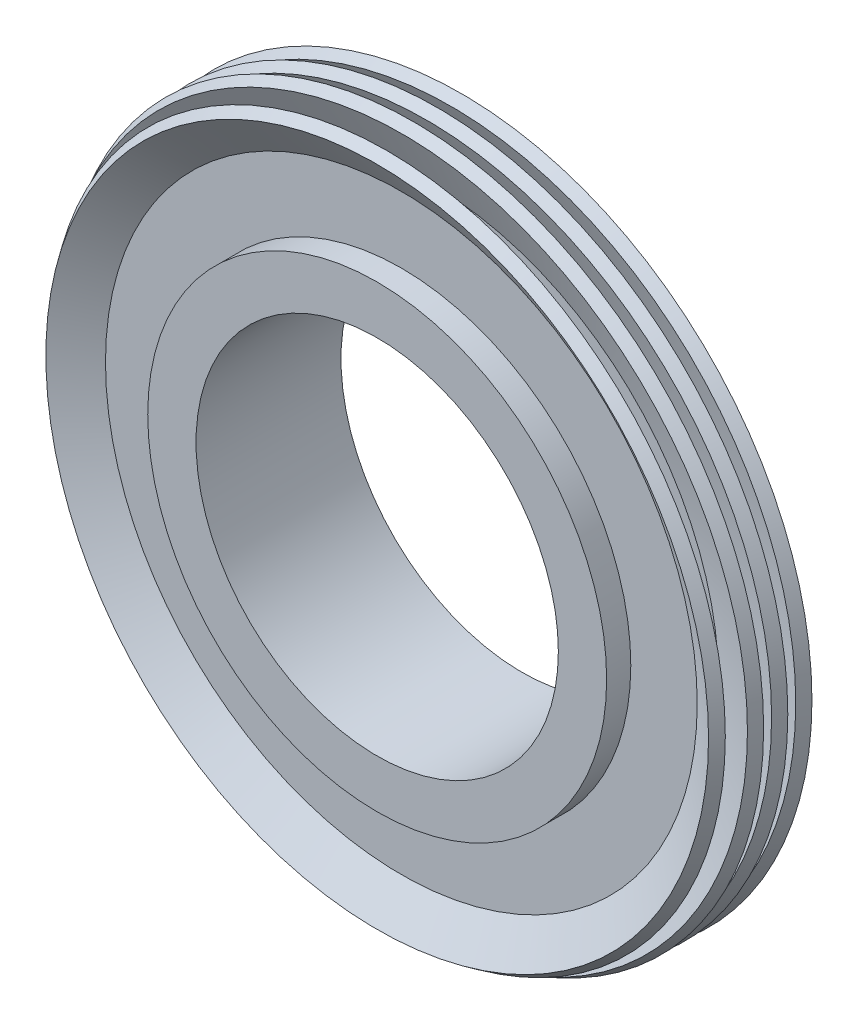
ISO-10303-21;
HEADER;
FILE_DESCRIPTION(('STEP AP214'),'2;1');
FILE_NAME('part.step','',(''),(''),'','','');
FILE_SCHEMA(('AUTOMOTIVE_DESIGN { 1 0 10303 214 1 1 1 1 }'));
ENDSEC;
DATA;
#1=APPLICATION_CONTEXT('core data for automotive mechanical design processes');
#2=APPLICATION_PROTOCOL_DEFINITION('international standard','automotive_design',2000,#1);
#3=PRODUCT_CONTEXT('',#1,'mechanical');
#4=PRODUCT('Part','Part','',(#3));
#5=PRODUCT_RELATED_PRODUCT_CATEGORY('part','',(#4));
#6=PRODUCT_DEFINITION_FORMATION('','',#4);
#7=PRODUCT_DEFINITION_CONTEXT('part definition',#1,'design');
#8=PRODUCT_DEFINITION('design','',#6,#7);
#9=PRODUCT_DEFINITION_SHAPE('','',#8);
#10=(LENGTH_UNIT() NAMED_UNIT(*) SI_UNIT(.MILLI.,.METRE.));
#11=(NAMED_UNIT(*) PLANE_ANGLE_UNIT() SI_UNIT($,.RADIAN.));
#12=(NAMED_UNIT(*) SI_UNIT($,.STERADIAN.) SOLID_ANGLE_UNIT());
#13=UNCERTAINTY_MEASURE_WITH_UNIT(LENGTH_MEASURE(1.E-05),#10,'distance_accuracy_value','');
#14=(GEOMETRIC_REPRESENTATION_CONTEXT(3) GLOBAL_UNCERTAINTY_ASSIGNED_CONTEXT((#13)) GLOBAL_UNIT_ASSIGNED_CONTEXT((#10,
#11,#12)) REPRESENTATION_CONTEXT('',''));
#15=CARTESIAN_POINT('',(0.,0.,0.));
#16=DIRECTION('',(0.,0.,1.));
#17=DIRECTION('',(1.,0.,0.));
#18=AXIS2_PLACEMENT_3D('',#15,#16,#17);
#19=CARTESIAN_POINT('',(0.,0.,12.));
#20=DIRECTION('',(0.,0.,-1.));
#21=DIRECTION('',(-1.,0.,0.));
#22=AXIS2_PLACEMENT_3D('',#19,#20,#21);
#23=CYLINDRICAL_SURFACE('',#22,19.);
#24=CARTESIAN_POINT('',(0.,0.,2.));
#25=DIRECTION('',(0.,0.,1.));
#26=DIRECTION('',(1.,0.,0.));
#27=AXIS2_PLACEMENT_3D('',#24,#25,#26);
#28=CIRCLE('',#27,19.);
#29=CARTESIAN_POINT('',(19.,0.,2.));
#30=VERTEX_POINT('',#29);
#31=EDGE_CURVE('E45',#30,#30,#28,.T.);
#32=ORIENTED_EDGE('',*,*,#31,.T.);
#33=EDGE_LOOP('',(#32));
#34=FACE_BOUND('',#33,.T.);
#35=CARTESIAN_POINT('',(0.,0.,2.5));
#36=DIRECTION('',(0.,0.,1.));
#37=DIRECTION('',(1.,0.,0.));
#38=AXIS2_PLACEMENT_3D('',#35,#36,#37);
#39=CIRCLE('',#38,19.);
#40=CARTESIAN_POINT('',(19.,0.,2.5));
#41=VERTEX_POINT('',#40);
#42=EDGE_CURVE('E10',#41,#41,#39,.T.);
#43=ORIENTED_EDGE('',*,*,#42,.F.);
#44=EDGE_LOOP('',(#43));
#45=FACE_BOUND('',#44,.T.);
#46=ADVANCED_FACE('F30',(#34,#45),#23,.T.);
#47=CARTESIAN_POINT('',(0.,0.,12.));
#48=DIRECTION('',(0.,0.,1.));
#49=DIRECTION('',(1.,0.,0.));
#50=AXIS2_PLACEMENT_3D('',#47,#48,#49);
#51=CIRCLE('',#50,19.);
#52=CARTESIAN_POINT('',(19.,0.,12.));
#53=VERTEX_POINT('',#52);
#54=EDGE_CURVE('E50',#53,#53,#51,.T.);
#55=ORIENTED_EDGE('',*,*,#54,.F.);
#56=EDGE_LOOP('',(#55));
#57=FACE_BOUND('',#56,.T.);
#58=CARTESIAN_POINT('',(0.,0.,10.));
#59=DIRECTION('',(0.,0.,-1.));
#60=DIRECTION('',(-1.,0.,0.));
#61=AXIS2_PLACEMENT_3D('',#58,#59,#60);
#62=CIRCLE('',#61,19.);
#63=CARTESIAN_POINT('',(-19.,0.,10.));
#64=VERTEX_POINT('',#63);
#65=EDGE_CURVE('E37',#64,#64,#62,.T.);
#66=ORIENTED_EDGE('',*,*,#65,.F.);
#67=EDGE_LOOP('',(#66));
#68=FACE_BOUND('',#67,.T.);
#69=ADVANCED_FACE('F264',(#57,#68),#23,.T.);
#70=CARTESIAN_POINT('',(0.,0.,12.));
#71=DIRECTION('',(0.,0.,1.));
#72=DIRECTION('',(1.,0.,0.));
#73=AXIS2_PLACEMENT_3D('',#70,#71,#72);
#74=PLANE('',#73);
#75=ORIENTED_EDGE('',*,*,#54,.T.);
#76=EDGE_LOOP('',(#75));
#77=FACE_BOUND('',#76,.T.);
#78=CARTESIAN_POINT('',(0.,0.,12.));
#79=DIRECTION('',(0.,0.,1.));
#80=DIRECTION('',(1.,0.,0.));
#81=AXIS2_PLACEMENT_3D('',#78,#79,#80);
#82=CIRCLE('',#81,15.);
#83=CARTESIAN_POINT('',(15.,0.,12.));
#84=VERTEX_POINT('',#83);
#85=EDGE_CURVE('E53',#84,#84,#82,.T.);
#86=ORIENTED_EDGE('',*,*,#85,.F.);
#87=EDGE_LOOP('',(#86));
#88=FACE_BOUND('',#87,.T.);
#89=ADVANCED_FACE('F269',(#77,#88),#74,.T.);
#90=CARTESIAN_POINT('',(0.,0.,0.));
#91=DIRECTION('',(0.,0.,1.));
#92=DIRECTION('',(1.,0.,0.));
#93=AXIS2_PLACEMENT_3D('',#90,#91,#92);
#94=PLANE('',#93);
#95=CARTESIAN_POINT('',(0.,0.,0.));
#96=DIRECTION('',(0.,0.,1.));
#97=DIRECTION('',(1.,0.,0.));
#98=AXIS2_PLACEMENT_3D('',#95,#96,#97);
#99=CIRCLE('',#98,15.5);
#100=CARTESIAN_POINT('',(15.5,0.,0.));
#101=VERTEX_POINT('',#100);
#102=EDGE_CURVE('E41',#101,#101,#99,.F.);
#103=ORIENTED_EDGE('',*,*,#102,.T.);
#104=EDGE_LOOP('',(#103));
#105=FACE_BOUND('',#104,.T.);
#106=CARTESIAN_POINT('',(0.,0.,0.));
#107=DIRECTION('',(0.,0.,1.));
#108=DIRECTION('',(1.,0.,0.));
#109=AXIS2_PLACEMENT_3D('',#106,#107,#108);
#110=CIRCLE('',#109,15.);
#111=CARTESIAN_POINT('',(15.,0.,0.));
#112=VERTEX_POINT('',#111);
#113=EDGE_CURVE('E54',#112,#112,#110,.T.);
#114=ORIENTED_EDGE('',*,*,#113,.T.);
#115=EDGE_LOOP('',(#114));
#116=FACE_BOUND('',#115,.T.);
#117=ADVANCED_FACE('F273',(#105,#116),#94,.F.);
#118=CARTESIAN_POINT('',(0.,0.,12.));
#119=DIRECTION('',(0.,0.,-1.));
#120=DIRECTION('',(-1.,0.,0.));
#121=AXIS2_PLACEMENT_3D('',#118,#119,#120);
#122=CYLINDRICAL_SURFACE('',#121,15.);
#123=ORIENTED_EDGE('',*,*,#85,.T.);
#124=EDGE_LOOP('',(#123));
#125=FACE_BOUND('',#124,.T.);
#126=ORIENTED_EDGE('',*,*,#113,.F.);
#127=EDGE_LOOP('',(#126));
#128=FACE_BOUND('',#127,.T.);
#129=ADVANCED_FACE('F260',(#125,#128),#122,.F.);
#130=CARTESIAN_POINT('',(0.,0.,2.));
#131=DIRECTION('',(0.,0.,1.));
#132=DIRECTION('',(1.,0.,0.));
#133=AXIS2_PLACEMENT_3D('',#130,#131,#132);
#134=CONICAL_SURFACE('',#133,19.,1.05165021254838);
#135=ORIENTED_EDGE('',*,*,#102,.F.);
#136=EDGE_LOOP('',(#135));
#137=FACE_BOUND('',#136,.T.);
#138=ORIENTED_EDGE('',*,*,#31,.F.);
#139=EDGE_LOOP('',(#138));
#140=FACE_BOUND('',#139,.T.);
#141=ADVANCED_FACE('F32',(#137,#140),#134,.T.);
#142=CARTESIAN_POINT('',(0.,19.,2.5));
#143=DIRECTION('',(0.,0.,1.));
#144=DIRECTION('',(1.,0.,0.));
#145=AXIS2_PLACEMENT_3D('',#142,#143,#144);
#146=PLANE('',#145);
#147=CARTESIAN_POINT('',(0.,0.,2.5));
#148=DIRECTION('',(0.,0.,1.));
#149=DIRECTION('',(1.,0.,0.));
#150=AXIS2_PLACEMENT_3D('',#147,#148,#149);
#151=CIRCLE('',#150,24.);
#152=CARTESIAN_POINT('',(24.,0.,2.5));
#153=VERTEX_POINT('',#152);
#154=EDGE_CURVE('E57',#153,#153,#151,.T.);
#155=ORIENTED_EDGE('',*,*,#154,.F.);
#156=EDGE_LOOP('',(#155));
#157=FACE_BOUND('',#156,.T.);
#158=ORIENTED_EDGE('',*,*,#42,.T.);
#159=EDGE_LOOP('',(#158));
#160=FACE_BOUND('',#159,.T.);
#161=ADVANCED_FACE('F251',(#157,#160),#146,.F.);
#162=CARTESIAN_POINT('',(0.,0.,2.5));
#163=DIRECTION('',(0.,0.,1.));
#164=DIRECTION('',(1.,0.,0.));
#165=AXIS2_PLACEMENT_3D('',#162,#163,#164);
#166=CONICAL_SURFACE('',#165,24.,1.10714871779409);
#167=CARTESIAN_POINT('',(0.,0.,5.));
#168=DIRECTION('',(0.,0.,1.));
#169=DIRECTION('',(1.,0.,0.));
#170=AXIS2_PLACEMENT_3D('',#167,#168,#169);
#171=CIRCLE('',#170,29.);
#172=CARTESIAN_POINT('',(29.,0.,5.));
#173=VERTEX_POINT('',#172);
#174=EDGE_CURVE('E62',#173,#173,#171,.T.);
#175=ORIENTED_EDGE('',*,*,#174,.F.);
#176=EDGE_LOOP('',(#175));
#177=FACE_BOUND('',#176,.T.);
#178=ORIENTED_EDGE('',*,*,#154,.T.);
#179=EDGE_LOOP('',(#178));
#180=FACE_BOUND('',#179,.T.);
#181=ADVANCED_FACE('F245',(#177,#180),#166,.T.);
#182=CARTESIAN_POINT('',(0.,0.,5.));
#183=DIRECTION('',(0.,0.,-1.));
#184=DIRECTION('',(-1.,0.,0.));
#185=AXIS2_PLACEMENT_3D('',#182,#183,#184);
#186=CONICAL_SURFACE('',#185,29.,0.463647609000805);
#187=CARTESIAN_POINT('',(0.,0.,5.89442719099991));
#188=DIRECTION('',(0.,0.,1.));
#189=DIRECTION('',(1.,0.,0.));
#190=AXIS2_PLACEMENT_3D('',#187,#188,#189);
#191=CIRCLE('',#190,28.5527864045);
#192=CARTESIAN_POINT('',(28.5527864045,0.,5.89442719099991));
#193=VERTEX_POINT('',#192);
#194=EDGE_CURVE('E65',#193,#193,#191,.T.);
#195=ORIENTED_EDGE('',*,*,#194,.F.);
#196=EDGE_LOOP('',(#195));
#197=FACE_BOUND('',#196,.T.);
#198=ORIENTED_EDGE('',*,*,#174,.T.);
#199=EDGE_LOOP('',(#198));
#200=FACE_BOUND('',#199,.T.);
#201=ADVANCED_FACE('F239',(#197,#200),#186,.T.);
#202=CARTESIAN_POINT('',(0.,0.,5.89442719099991));
#203=DIRECTION('',(0.,0.,1.));
#204=DIRECTION('',(1.,0.,0.));
#205=AXIS2_PLACEMENT_3D('',#202,#203,#204);
#206=CONICAL_SURFACE('',#205,28.5527864045,1.10714871779409);
#207=CARTESIAN_POINT('',(0.,0.,3.5));
#208=DIRECTION('',(0.,0.,1.));
#209=DIRECTION('',(1.,0.,0.));
#210=AXIS2_PLACEMENT_3D('',#207,#208,#209);
#211=CIRCLE('',#210,23.7639320225002);
#212=CARTESIAN_POINT('',(23.7639320225002,0.,3.5));
#213=VERTEX_POINT('',#212);
#214=EDGE_CURVE('E68',#213,#213,#211,.T.);
#215=ORIENTED_EDGE('',*,*,#214,.F.);
#216=EDGE_LOOP('',(#215));
#217=FACE_BOUND('',#216,.T.);
#218=ORIENTED_EDGE('',*,*,#194,.T.);
#219=EDGE_LOOP('',(#218));
#220=FACE_BOUND('',#219,.T.);
#221=ADVANCED_FACE('F233',(#217,#220),#206,.F.);
#222=CARTESIAN_POINT('',(0.,20.,3.5));
#223=DIRECTION('',(0.,0.,-1.));
#224=DIRECTION('',(-1.,0.,0.));
#225=AXIS2_PLACEMENT_3D('',#222,#223,#224);
#226=PLANE('',#225);
#227=CARTESIAN_POINT('',(0.,0.,3.5));
#228=DIRECTION('',(0.,0.,1.));
#229=DIRECTION('',(1.,0.,0.));
#230=AXIS2_PLACEMENT_3D('',#227,#228,#229);
#231=CIRCLE('',#230,20.);
#232=CARTESIAN_POINT('',(20.,0.,3.5));
#233=VERTEX_POINT('',#232);
#234=EDGE_CURVE('E71',#233,#233,#231,.T.);
#235=ORIENTED_EDGE('',*,*,#234,.F.);
#236=EDGE_LOOP('',(#235));
#237=FACE_BOUND('',#236,.T.);
#238=ORIENTED_EDGE('',*,*,#214,.T.);
#239=EDGE_LOOP('',(#238));
#240=FACE_BOUND('',#239,.T.);
#241=ADVANCED_FACE('F227',(#237,#240),#226,.F.);
#242=CARTESIAN_POINT('',(0.,0.,10.));
#243=DIRECTION('',(0.,0.,1.));
#244=DIRECTION('',(1.,0.,0.));
#245=AXIS2_PLACEMENT_3D('',#242,#243,#244);
#246=CYLINDRICAL_SURFACE('',#245,20.);
#247=CARTESIAN_POINT('',(0.,0.,4.5));
#248=DIRECTION('',(0.,0.,1.));
#249=DIRECTION('',(1.,0.,0.));
#250=AXIS2_PLACEMENT_3D('',#247,#248,#249);
#251=CIRCLE('',#250,20.);
#252=CARTESIAN_POINT('',(20.,0.,4.5));
#253=VERTEX_POINT('',#252);
#254=EDGE_CURVE('E74',#253,#253,#251,.T.);
#255=ORIENTED_EDGE('',*,*,#254,.F.);
#256=EDGE_LOOP('',(#255));
#257=FACE_BOUND('',#256,.T.);
#258=ORIENTED_EDGE('',*,*,#234,.T.);
#259=EDGE_LOOP('',(#258));
#260=FACE_BOUND('',#259,.T.);
#261=ADVANCED_FACE('F221',(#257,#260),#246,.T.);
#262=CARTESIAN_POINT('',(0.,20.,4.5));
#263=DIRECTION('',(0.,0.,1.));
#264=DIRECTION('',(1.,0.,0.));
#265=AXIS2_PLACEMENT_3D('',#262,#263,#264);
#266=PLANE('',#265);
#267=CARTESIAN_POINT('',(0.,0.,4.5));
#268=DIRECTION('',(0.,0.,1.));
#269=DIRECTION('',(1.,0.,0.));
#270=AXIS2_PLACEMENT_3D('',#267,#268,#269);
#271=CIRCLE('',#270,24.);
#272=CARTESIAN_POINT('',(24.,0.,4.5));
#273=VERTEX_POINT('',#272);
#274=EDGE_CURVE('E77',#273,#273,#271,.T.);
#275=ORIENTED_EDGE('',*,*,#274,.F.);
#276=EDGE_LOOP('',(#275));
#277=FACE_BOUND('',#276,.T.);
#278=ORIENTED_EDGE('',*,*,#254,.T.);
#279=EDGE_LOOP('',(#278));
#280=FACE_BOUND('',#279,.T.);
#281=ADVANCED_FACE('F215',(#277,#280),#266,.F.);
#282=CARTESIAN_POINT('',(0.,0.,4.5));
#283=DIRECTION('',(0.,0.,1.));
#284=DIRECTION('',(1.,0.,0.));
#285=AXIS2_PLACEMENT_3D('',#282,#283,#284);
#286=CONICAL_SURFACE('',#285,24.,1.10714871779409);
#287=CARTESIAN_POINT('',(0.,0.,7.));
#288=DIRECTION('',(0.,0.,1.));
#289=DIRECTION('',(1.,0.,0.));
#290=AXIS2_PLACEMENT_3D('',#287,#288,#289);
#291=CIRCLE('',#290,29.);
#292=CARTESIAN_POINT('',(29.,0.,7.));
#293=VERTEX_POINT('',#292);
#294=EDGE_CURVE('E80',#293,#293,#291,.T.);
#295=ORIENTED_EDGE('',*,*,#294,.F.);
#296=EDGE_LOOP('',(#295));
#297=FACE_BOUND('',#296,.T.);
#298=ORIENTED_EDGE('',*,*,#274,.T.);
#299=EDGE_LOOP('',(#298));
#300=FACE_BOUND('',#299,.T.);
#301=ADVANCED_FACE('F209',(#297,#300),#286,.T.);
#302=CARTESIAN_POINT('',(0.,0.,7.));
#303=DIRECTION('',(0.,0.,-1.));
#304=DIRECTION('',(-1.,0.,0.));
#305=AXIS2_PLACEMENT_3D('',#302,#303,#304);
#306=CONICAL_SURFACE('',#305,29.,0.463647609000805);
#307=CARTESIAN_POINT('',(0.,0.,7.89442719099991));
#308=DIRECTION('',(0.,0.,1.));
#309=DIRECTION('',(1.,0.,0.));
#310=AXIS2_PLACEMENT_3D('',#307,#308,#309);
#311=CIRCLE('',#310,28.5527864045);
#312=CARTESIAN_POINT('',(28.5527864045,0.,7.89442719099991));
#313=VERTEX_POINT('',#312);
#314=EDGE_CURVE('E83',#313,#313,#311,.T.);
#315=ORIENTED_EDGE('',*,*,#314,.F.);
#316=EDGE_LOOP('',(#315));
#317=FACE_BOUND('',#316,.T.);
#318=ORIENTED_EDGE('',*,*,#294,.T.);
#319=EDGE_LOOP('',(#318));
#320=FACE_BOUND('',#319,.T.);
#321=ADVANCED_FACE('F203',(#317,#320),#306,.T.);
#322=CARTESIAN_POINT('',(0.,0.,7.89442719099991));
#323=DIRECTION('',(0.,0.,1.));
#324=DIRECTION('',(1.,0.,0.));
#325=AXIS2_PLACEMENT_3D('',#322,#323,#324);
#326=CONICAL_SURFACE('',#325,28.5527864045,1.10714871779409);
#327=CARTESIAN_POINT('',(0.,0.,5.5));
#328=DIRECTION('',(0.,0.,1.));
#329=DIRECTION('',(1.,0.,0.));
#330=AXIS2_PLACEMENT_3D('',#327,#328,#329);
#331=CIRCLE('',#330,23.7639320225002);
#332=CARTESIAN_POINT('',(23.7639320225002,0.,5.5));
#333=VERTEX_POINT('',#332);
#334=EDGE_CURVE('E86',#333,#333,#331,.T.);
#335=ORIENTED_EDGE('',*,*,#334,.F.);
#336=EDGE_LOOP('',(#335));
#337=FACE_BOUND('',#336,.T.);
#338=ORIENTED_EDGE('',*,*,#314,.T.);
#339=EDGE_LOOP('',(#338));
#340=FACE_BOUND('',#339,.T.);
#341=ADVANCED_FACE('F197',(#337,#340),#326,.F.);
#342=CARTESIAN_POINT('',(0.,20.,5.5));
#343=DIRECTION('',(0.,0.,-1.));
#344=DIRECTION('',(-1.,0.,0.));
#345=AXIS2_PLACEMENT_3D('',#342,#343,#344);
#346=PLANE('',#345);
#347=CARTESIAN_POINT('',(0.,0.,5.5));
#348=DIRECTION('',(0.,0.,1.));
#349=DIRECTION('',(1.,0.,0.));
#350=AXIS2_PLACEMENT_3D('',#347,#348,#349);
#351=CIRCLE('',#350,20.);
#352=CARTESIAN_POINT('',(20.,0.,5.5));
#353=VERTEX_POINT('',#352);
#354=EDGE_CURVE('E89',#353,#353,#351,.T.);
#355=ORIENTED_EDGE('',*,*,#354,.F.);
#356=EDGE_LOOP('',(#355));
#357=FACE_BOUND('',#356,.T.);
#358=ORIENTED_EDGE('',*,*,#334,.T.);
#359=EDGE_LOOP('',(#358));
#360=FACE_BOUND('',#359,.T.);
#361=ADVANCED_FACE('F191',(#357,#360),#346,.F.);
#362=CARTESIAN_POINT('',(0.,0.,10.));
#363=DIRECTION('',(0.,0.,1.));
#364=DIRECTION('',(1.,0.,0.));
#365=AXIS2_PLACEMENT_3D('',#362,#363,#364);
#366=CYLINDRICAL_SURFACE('',#365,20.);
#367=CARTESIAN_POINT('',(0.,0.,6.5));
#368=DIRECTION('',(0.,0.,1.));
#369=DIRECTION('',(1.,0.,0.));
#370=AXIS2_PLACEMENT_3D('',#367,#368,#369);
#371=CIRCLE('',#370,20.);
#372=CARTESIAN_POINT('',(20.,0.,6.5));
#373=VERTEX_POINT('',#372);
#374=EDGE_CURVE('E92',#373,#373,#371,.T.);
#375=ORIENTED_EDGE('',*,*,#374,.F.);
#376=EDGE_LOOP('',(#375));
#377=FACE_BOUND('',#376,.T.);
#378=ORIENTED_EDGE('',*,*,#354,.T.);
#379=EDGE_LOOP('',(#378));
#380=FACE_BOUND('',#379,.T.);
#381=ADVANCED_FACE('F185',(#377,#380),#366,.T.);
#382=CARTESIAN_POINT('',(0.,20.,6.5));
#383=DIRECTION('',(0.,0.,1.));
#384=DIRECTION('',(1.,0.,0.));
#385=AXIS2_PLACEMENT_3D('',#382,#383,#384);
#386=PLANE('',#385);
#387=CARTESIAN_POINT('',(0.,0.,6.5));
#388=DIRECTION('',(0.,0.,1.));
#389=DIRECTION('',(1.,0.,0.));
#390=AXIS2_PLACEMENT_3D('',#387,#388,#389);
#391=CIRCLE('',#390,24.);
#392=CARTESIAN_POINT('',(24.,0.,6.5));
#393=VERTEX_POINT('',#392);
#394=EDGE_CURVE('E95',#393,#393,#391,.T.);
#395=ORIENTED_EDGE('',*,*,#394,.F.);
#396=EDGE_LOOP('',(#395));
#397=FACE_BOUND('',#396,.T.);
#398=ORIENTED_EDGE('',*,*,#374,.T.);
#399=EDGE_LOOP('',(#398));
#400=FACE_BOUND('',#399,.T.);
#401=ADVANCED_FACE('F179',(#397,#400),#386,.F.);
#402=CARTESIAN_POINT('',(0.,0.,6.5));
#403=DIRECTION('',(0.,0.,1.));
#404=DIRECTION('',(1.,0.,0.));
#405=AXIS2_PLACEMENT_3D('',#402,#403,#404);
#406=CONICAL_SURFACE('',#405,24.,1.10714871779409);
#407=CARTESIAN_POINT('',(0.,0.,9.));
#408=DIRECTION('',(0.,0.,1.));
#409=DIRECTION('',(1.,0.,0.));
#410=AXIS2_PLACEMENT_3D('',#407,#408,#409);
#411=CIRCLE('',#410,29.);
#412=CARTESIAN_POINT('',(29.,0.,9.));
#413=VERTEX_POINT('',#412);
#414=EDGE_CURVE('E98',#413,#413,#411,.T.);
#415=ORIENTED_EDGE('',*,*,#414,.F.);
#416=EDGE_LOOP('',(#415));
#417=FACE_BOUND('',#416,.T.);
#418=ORIENTED_EDGE('',*,*,#394,.T.);
#419=EDGE_LOOP('',(#418));
#420=FACE_BOUND('',#419,.T.);
#421=ADVANCED_FACE('F173',(#417,#420),#406,.T.);
#422=CARTESIAN_POINT('',(0.,0.,9.));
#423=DIRECTION('',(0.,0.,-1.));
#424=DIRECTION('',(-1.,0.,0.));
#425=AXIS2_PLACEMENT_3D('',#422,#423,#424);
#426=CONICAL_SURFACE('',#425,29.,0.463647609000806);
#427=CARTESIAN_POINT('',(0.,0.,9.89442719099991));
#428=DIRECTION('',(0.,0.,1.));
#429=DIRECTION('',(1.,0.,0.));
#430=AXIS2_PLACEMENT_3D('',#427,#428,#429);
#431=CIRCLE('',#430,28.5527864045);
#432=CARTESIAN_POINT('',(28.5527864045,0.,9.89442719099991));
#433=VERTEX_POINT('',#432);
#434=EDGE_CURVE('E101',#433,#433,#431,.T.);
#435=ORIENTED_EDGE('',*,*,#434,.F.);
#436=EDGE_LOOP('',(#435));
#437=FACE_BOUND('',#436,.T.);
#438=ORIENTED_EDGE('',*,*,#414,.T.);
#439=EDGE_LOOP('',(#438));
#440=FACE_BOUND('',#439,.T.);
#441=ADVANCED_FACE('F167',(#437,#440),#426,.T.);
#442=CARTESIAN_POINT('',(0.,0.,9.89442719099991));
#443=DIRECTION('',(0.,0.,1.));
#444=DIRECTION('',(1.,0.,0.));
#445=AXIS2_PLACEMENT_3D('',#442,#443,#444);
#446=CONICAL_SURFACE('',#445,28.5527864045,1.10714871779409);
#447=CARTESIAN_POINT('',(0.,0.,7.5));
#448=DIRECTION('',(0.,0.,1.));
#449=DIRECTION('',(1.,0.,0.));
#450=AXIS2_PLACEMENT_3D('',#447,#448,#449);
#451=CIRCLE('',#450,23.7639320225002);
#452=CARTESIAN_POINT('',(23.7639320225002,0.,7.5));
#453=VERTEX_POINT('',#452);
#454=EDGE_CURVE('E104',#453,#453,#451,.T.);
#455=ORIENTED_EDGE('',*,*,#454,.F.);
#456=EDGE_LOOP('',(#455));
#457=FACE_BOUND('',#456,.T.);
#458=ORIENTED_EDGE('',*,*,#434,.T.);
#459=EDGE_LOOP('',(#458));
#460=FACE_BOUND('',#459,.T.);
#461=ADVANCED_FACE('F161',(#457,#460),#446,.F.);
#462=CARTESIAN_POINT('',(0.,20.,7.5));
#463=DIRECTION('',(0.,0.,-1.));
#464=DIRECTION('',(-1.,0.,0.));
#465=AXIS2_PLACEMENT_3D('',#462,#463,#464);
#466=PLANE('',#465);
#467=CARTESIAN_POINT('',(0.,0.,7.5));
#468=DIRECTION('',(0.,0.,1.));
#469=DIRECTION('',(1.,0.,0.));
#470=AXIS2_PLACEMENT_3D('',#467,#468,#469);
#471=CIRCLE('',#470,20.);
#472=CARTESIAN_POINT('',(20.,0.,7.5));
#473=VERTEX_POINT('',#472);
#474=EDGE_CURVE('E107',#473,#473,#471,.T.);
#475=ORIENTED_EDGE('',*,*,#474,.F.);
#476=EDGE_LOOP('',(#475));
#477=FACE_BOUND('',#476,.T.);
#478=ORIENTED_EDGE('',*,*,#454,.T.);
#479=EDGE_LOOP('',(#478));
#480=FACE_BOUND('',#479,.T.);
#481=ADVANCED_FACE('F155',(#477,#480),#466,.F.);
#482=CARTESIAN_POINT('',(0.,0.,10.));
#483=DIRECTION('',(0.,0.,1.));
#484=DIRECTION('',(1.,0.,0.));
#485=AXIS2_PLACEMENT_3D('',#482,#483,#484);
#486=CYLINDRICAL_SURFACE('',#485,20.);
#487=CARTESIAN_POINT('',(0.,0.,9.));
#488=DIRECTION('',(0.,0.,1.));
#489=DIRECTION('',(1.,0.,0.));
#490=AXIS2_PLACEMENT_3D('',#487,#488,#489);
#491=CIRCLE('',#490,20.);
#492=CARTESIAN_POINT('',(20.,0.,9.));
#493=VERTEX_POINT('',#492);
#494=EDGE_CURVE('E110',#493,#493,#491,.T.);
#495=ORIENTED_EDGE('',*,*,#494,.F.);
#496=EDGE_LOOP('',(#495));
#497=FACE_BOUND('',#496,.T.);
#498=ORIENTED_EDGE('',*,*,#474,.T.);
#499=EDGE_LOOP('',(#498));
#500=FACE_BOUND('',#499,.T.);
#501=ADVANCED_FACE('F149',(#497,#500),#486,.T.);
#502=CARTESIAN_POINT('',(0.,20.,9.));
#503=DIRECTION('',(0.,0.,1.));
#504=DIRECTION('',(1.,0.,0.));
#505=AXIS2_PLACEMENT_3D('',#502,#503,#504);
#506=PLANE('',#505);
#507=CARTESIAN_POINT('',(0.,0.,9.));
#508=DIRECTION('',(0.,0.,1.));
#509=DIRECTION('',(1.,0.,0.));
#510=AXIS2_PLACEMENT_3D('',#507,#508,#509);
#511=CIRCLE('',#510,24.8081376524612);
#512=CARTESIAN_POINT('',(24.8081376524612,0.,9.));
#513=VERTEX_POINT('',#512);
#514=EDGE_CURVE('E113',#513,#513,#511,.T.);
#515=ORIENTED_EDGE('',*,*,#514,.F.);
#516=EDGE_LOOP('',(#515));
#517=FACE_BOUND('',#516,.T.);
#518=ORIENTED_EDGE('',*,*,#494,.T.);
#519=EDGE_LOOP('',(#518));
#520=FACE_BOUND('',#519,.T.);
#521=ADVANCED_FACE('F143',(#517,#520),#506,.F.);
#522=CARTESIAN_POINT('',(0.,0.,9.));
#523=DIRECTION('',(0.,0.,1.));
#524=DIRECTION('',(1.,0.,0.));
#525=AXIS2_PLACEMENT_3D('',#522,#523,#524);
#526=CONICAL_SURFACE('',#525,24.8081376524612,0.972984908577426);
#527=CARTESIAN_POINT('',(0.,0.,11.1734305964786));
#528=DIRECTION('',(0.,0.,1.));
#529=DIRECTION('',(1.,0.,0.));
#530=AXIS2_PLACEMENT_3D('',#527,#528,#529);
#531=CIRCLE('',#530,28.);
#532=CARTESIAN_POINT('',(28.,0.,11.1734305964786));
#533=VERTEX_POINT('',#532);
#534=EDGE_CURVE('E116',#533,#533,#531,.T.);
#535=ORIENTED_EDGE('',*,*,#534,.F.);
#536=EDGE_LOOP('',(#535));
#537=FACE_BOUND('',#536,.T.);
#538=ORIENTED_EDGE('',*,*,#514,.T.);
#539=EDGE_LOOP('',(#538));
#540=FACE_BOUND('',#539,.T.);
#541=ADVANCED_FACE('F137',(#537,#540),#526,.T.);
#542=CARTESIAN_POINT('',(0.,0.,11.1734305964786));
#543=DIRECTION('',(0.,0.,-1.));
#544=DIRECTION('',(-1.,0.,0.));
#545=AXIS2_PLACEMENT_3D('',#542,#543,#544);
#546=CONICAL_SURFACE('',#545,28.,0.597811418217475);
#547=CARTESIAN_POINT('',(0.,0.,12.));
#548=DIRECTION('',(0.,0.,1.));
#549=DIRECTION('',(1.,0.,0.));
#550=AXIS2_PLACEMENT_3D('',#547,#548,#549);
#551=CIRCLE('',#550,27.4371651919414);
#552=CARTESIAN_POINT('',(27.4371651919414,0.,12.));
#553=VERTEX_POINT('',#552);
#554=EDGE_CURVE('E119',#553,#553,#551,.T.);
#555=ORIENTED_EDGE('',*,*,#554,.F.);
#556=EDGE_LOOP('',(#555));
#557=FACE_BOUND('',#556,.T.);
#558=ORIENTED_EDGE('',*,*,#534,.T.);
#559=EDGE_LOOP('',(#558));
#560=FACE_BOUND('',#559,.T.);
#561=ADVANCED_FACE('F131',(#557,#560),#546,.T.);
#562=CARTESIAN_POINT('',(0.,0.,12.));
#563=DIRECTION('',(0.,0.,1.));
#564=DIRECTION('',(1.,0.,0.));
#565=AXIS2_PLACEMENT_3D('',#562,#563,#564);
#566=CONICAL_SURFACE('',#565,27.4371651919414,0.972984908577426);
#567=CARTESIAN_POINT('',(0.,0.,10.));
#568=DIRECTION('',(0.,0.,1.));
#569=DIRECTION('',(1.,0.,0.));
#570=AXIS2_PLACEMENT_3D('',#567,#568,#569);
#571=CIRCLE('',#570,24.5);
#572=CARTESIAN_POINT('',(24.5,0.,10.));
#573=VERTEX_POINT('',#572);
#574=EDGE_CURVE('E122',#573,#573,#571,.T.);
#575=ORIENTED_EDGE('',*,*,#574,.F.);
#576=EDGE_LOOP('',(#575));
#577=FACE_BOUND('',#576,.T.);
#578=ORIENTED_EDGE('',*,*,#554,.T.);
#579=EDGE_LOOP('',(#578));
#580=FACE_BOUND('',#579,.T.);
#581=ADVANCED_FACE('F128',(#577,#580),#566,.F.);
#582=CARTESIAN_POINT('',(0.,19.,10.));
#583=DIRECTION('',(0.,0.,-1.));
#584=DIRECTION('',(-1.,0.,0.));
#585=AXIS2_PLACEMENT_3D('',#582,#583,#584);
#586=PLANE('',#585);
#587=ORIENTED_EDGE('',*,*,#65,.T.);
#588=EDGE_LOOP('',(#587));
#589=FACE_BOUND('',#588,.T.);
#590=ORIENTED_EDGE('',*,*,#574,.T.);
#591=EDGE_LOOP('',(#590));
#592=FACE_BOUND('',#591,.T.);
#593=ADVANCED_FACE('F126',(#589,#592),#586,.F.);
#594=CLOSED_SHELL('',(#46,#69,#89,#117,#129,#141,#161,#181,#201,#221,#241,#261,#281,#301,#321,
#341,#361,#381,#401,#421,#441,#461,#481,#501,#521,#541,#561,#581,#593));
#595=MANIFOLD_SOLID_BREP('B2',#594);
#596=ADVANCED_BREP_SHAPE_REPRESENTATION('',(#18,#595),#14);
#597=SHAPE_DEFINITION_REPRESENTATION(#9,#596);
ENDSEC;
END-ISO-10303-21;
